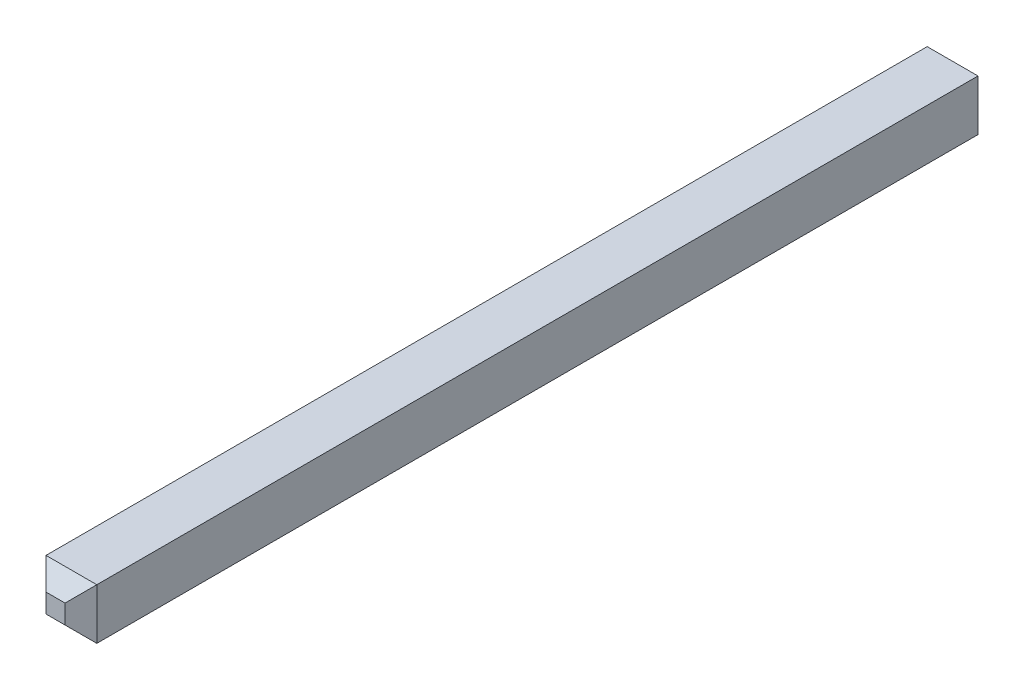
ISO-10303-21;
HEADER;
FILE_DESCRIPTION(('STEP AP214'),'2;1');
FILE_NAME('part.step','',(''),(''),'','','');
FILE_SCHEMA(('AUTOMOTIVE_DESIGN { 1 0 10303 214 1 1 1 1 }'));
ENDSEC;
DATA;
#1=APPLICATION_CONTEXT('core data for automotive mechanical design processes');
#2=APPLICATION_PROTOCOL_DEFINITION('international standard','automotive_design',2000,#1);
#3=PRODUCT_CONTEXT('',#1,'mechanical');
#4=PRODUCT('Part','Part','',(#3));
#5=PRODUCT_RELATED_PRODUCT_CATEGORY('part','',(#4));
#6=PRODUCT_DEFINITION_FORMATION('','',#4);
#7=PRODUCT_DEFINITION_CONTEXT('part definition',#1,'design');
#8=PRODUCT_DEFINITION('design','',#6,#7);
#9=PRODUCT_DEFINITION_SHAPE('','',#8);
#10=(LENGTH_UNIT() NAMED_UNIT(*) SI_UNIT(.MILLI.,.METRE.));
#11=(NAMED_UNIT(*) PLANE_ANGLE_UNIT() SI_UNIT($,.RADIAN.));
#12=(NAMED_UNIT(*) SI_UNIT($,.STERADIAN.) SOLID_ANGLE_UNIT());
#13=UNCERTAINTY_MEASURE_WITH_UNIT(LENGTH_MEASURE(1.E-05),#10,'distance_accuracy_value','');
#14=(GEOMETRIC_REPRESENTATION_CONTEXT(3) GLOBAL_UNCERTAINTY_ASSIGNED_CONTEXT((#13)) GLOBAL_UNIT_ASSIGNED_CONTEXT((#10,
#11,#12)) REPRESENTATION_CONTEXT('',''));
#15=CARTESIAN_POINT('',(0.,0.,0.));
#16=DIRECTION('',(0.,0.,1.));
#17=DIRECTION('',(1.,0.,0.));
#18=AXIS2_PLACEMENT_3D('',#15,#16,#17);
#19=CARTESIAN_POINT('',(0.32,0.32,-3.5));
#20=DIRECTION('',(1.,0.,0.));
#21=DIRECTION('',(0.,1.,0.));
#22=AXIS2_PLACEMENT_3D('',#19,#20,#21);
#23=PLANE('',#22);
#24=DIRECTION('',(0.,0.,1.));
#25=VECTOR('',#24,1.);
#26=CARTESIAN_POINT('',(0.32,0.32,-3.5));
#27=LINE('',#26,#25);
#28=CARTESIAN_POINT('',(0.32,0.32,-3.3));
#29=VERTEX_POINT('',#28);
#30=CARTESIAN_POINT('',(0.32,0.32,7.8));
#31=VERTEX_POINT('',#30);
#32=EDGE_CURVE('E121',#29,#31,#27,.T.);
#33=ORIENTED_EDGE('',*,*,#32,.T.);
#34=DIRECTION('',(0.,-1.,0.));
#35=VECTOR('',#34,1.);
#36=CARTESIAN_POINT('',(0.32,0.32,7.8));
#37=LINE('',#36,#35);
#38=CARTESIAN_POINT('',(0.32,-0.32,7.8));
#39=VERTEX_POINT('',#38);
#40=EDGE_CURVE('E140',#31,#39,#37,.T.);
#41=ORIENTED_EDGE('',*,*,#40,.T.);
#42=DIRECTION('',(0.,0.,1.));
#43=VECTOR('',#42,1.);
#44=CARTESIAN_POINT('',(0.32,-0.32,-3.5));
#45=LINE('',#44,#43);
#46=CARTESIAN_POINT('',(0.32,-0.32,-3.3));
#47=VERTEX_POINT('',#46);
#48=EDGE_CURVE('E127',#47,#39,#45,.T.);
#49=ORIENTED_EDGE('',*,*,#48,.F.);
#50=DIRECTION('',(0.,1.,0.));
#51=VECTOR('',#50,1.);
#52=CARTESIAN_POINT('',(0.32,0.32,-3.3));
#53=LINE('',#52,#51);
#54=EDGE_CURVE('E138',#47,#29,#53,.T.);
#55=ORIENTED_EDGE('',*,*,#54,.T.);
#56=EDGE_LOOP('',(#33,#41,#49,#55));
#57=FACE_BOUND('',#56,.T.);
#58=ADVANCED_FACE('F35',(#57),#23,.T.);
#59=CARTESIAN_POINT('',(-0.32,-0.32,-3.5));
#60=DIRECTION('',(0.,-1.,0.));
#61=DIRECTION('',(0.,0.,-1.));
#62=AXIS2_PLACEMENT_3D('',#59,#60,#61);
#63=PLANE('',#62);
#64=ORIENTED_EDGE('',*,*,#48,.T.);
#65=DIRECTION('',(-1.,0.,0.));
#66=VECTOR('',#65,1.);
#67=CARTESIAN_POINT('',(-0.32,-0.32,7.8));
#68=LINE('',#67,#66);
#69=CARTESIAN_POINT('',(-0.32,-0.32,7.8));
#70=VERTEX_POINT('',#69);
#71=EDGE_CURVE('E153',#39,#70,#68,.T.);
#72=ORIENTED_EDGE('',*,*,#71,.T.);
#73=DIRECTION('',(0.,0.,1.));
#74=VECTOR('',#73,1.);
#75=CARTESIAN_POINT('',(-0.32,-0.32,-3.5));
#76=LINE('',#75,#74);
#77=CARTESIAN_POINT('',(-0.32,-0.32,-3.3));
#78=VERTEX_POINT('',#77);
#79=EDGE_CURVE('E130',#78,#70,#76,.T.);
#80=ORIENTED_EDGE('',*,*,#79,.F.);
#81=DIRECTION('',(1.,0.,0.));
#82=VECTOR('',#81,1.);
#83=CARTESIAN_POINT('',(0.32,-0.32,-3.3));
#84=LINE('',#83,#82);
#85=EDGE_CURVE('E151',#78,#47,#84,.T.);
#86=ORIENTED_EDGE('',*,*,#85,.T.);
#87=EDGE_LOOP('',(#64,#72,#80,#86));
#88=FACE_BOUND('',#87,.T.);
#89=ADVANCED_FACE('F213',(#88),#63,.T.);
#90=CARTESIAN_POINT('',(-0.32,0.32,-3.5));
#91=DIRECTION('',(-1.,0.,0.));
#92=DIRECTION('',(0.,-1.,0.));
#93=AXIS2_PLACEMENT_3D('',#90,#91,#92);
#94=PLANE('',#93);
#95=ORIENTED_EDGE('',*,*,#79,.T.);
#96=DIRECTION('',(0.,1.,0.));
#97=VECTOR('',#96,1.);
#98=CARTESIAN_POINT('',(-0.32,0.32,7.8));
#99=LINE('',#98,#97);
#100=CARTESIAN_POINT('',(-0.32,0.32,7.8));
#101=VERTEX_POINT('',#100);
#102=EDGE_CURVE('E118',#70,#101,#99,.T.);
#103=ORIENTED_EDGE('',*,*,#102,.T.);
#104=DIRECTION('',(0.,0.,1.));
#105=VECTOR('',#104,1.);
#106=CARTESIAN_POINT('',(-0.32,0.32,-3.5));
#107=LINE('',#106,#105);
#108=CARTESIAN_POINT('',(-0.32,0.32,-3.3));
#109=VERTEX_POINT('',#108);
#110=EDGE_CURVE('E191',#109,#101,#107,.T.);
#111=ORIENTED_EDGE('',*,*,#110,.F.);
#112=DIRECTION('',(0.,-1.,0.));
#113=VECTOR('',#112,1.);
#114=CARTESIAN_POINT('',(-0.32,-0.32,-3.3));
#115=LINE('',#114,#113);
#116=EDGE_CURVE('E148',#109,#78,#115,.T.);
#117=ORIENTED_EDGE('',*,*,#116,.T.);
#118=EDGE_LOOP('',(#95,#103,#111,#117));
#119=FACE_BOUND('',#118,.T.);
#120=ADVANCED_FACE('F193',(#119),#94,.T.);
#121=CARTESIAN_POINT('',(-0.32,0.32,-3.5));
#122=DIRECTION('',(0.,1.,0.));
#123=DIRECTION('',(0.,0.,1.));
#124=AXIS2_PLACEMENT_3D('',#121,#122,#123);
#125=PLANE('',#124);
#126=ORIENTED_EDGE('',*,*,#110,.T.);
#127=DIRECTION('',(1.,0.,0.));
#128=VECTOR('',#127,1.);
#129=CARTESIAN_POINT('',(-0.32,0.32,7.8));
#130=LINE('',#129,#128);
#131=EDGE_CURVE('E146',#101,#31,#130,.T.);
#132=ORIENTED_EDGE('',*,*,#131,.T.);
#133=ORIENTED_EDGE('',*,*,#32,.F.);
#134=DIRECTION('',(-1.,0.,0.));
#135=VECTOR('',#134,1.);
#136=CARTESIAN_POINT('',(-0.32,0.32,-3.3));
#137=LINE('',#136,#135);
#138=EDGE_CURVE('E143',#29,#109,#137,.T.);
#139=ORIENTED_EDGE('',*,*,#138,.T.);
#140=EDGE_LOOP('',(#126,#132,#133,#139));
#141=FACE_BOUND('',#140,.T.);
#142=ADVANCED_FACE('F190',(#141),#125,.T.);
#143=CARTESIAN_POINT('',(0.,0.,-3.5));
#144=DIRECTION('',(0.,0.,1.));
#145=DIRECTION('',(1.,0.,0.));
#146=AXIS2_PLACEMENT_3D('',#143,#144,#145);
#147=PLANE('',#146);
#148=DIRECTION('',(0.,1.,0.));
#149=VECTOR('',#148,1.);
#150=CARTESIAN_POINT('',(-0.119999999999999,0.32,-3.5));
#151=LINE('',#150,#149);
#152=CARTESIAN_POINT('',(-0.119999999999999,-0.12,-3.5));
#153=VERTEX_POINT('',#152);
#154=CARTESIAN_POINT('',(-0.119999999999999,0.119999999999999,-3.5));
#155=VERTEX_POINT('',#154);
#156=EDGE_CURVE('E44',#153,#155,#151,.T.);
#157=ORIENTED_EDGE('',*,*,#156,.T.);
#158=DIRECTION('',(1.,0.,0.));
#159=VECTOR('',#158,1.);
#160=CARTESIAN_POINT('',(0.32,0.119999999999999,-3.5));
#161=LINE('',#160,#159);
#162=CARTESIAN_POINT('',(0.12,0.119999999999999,-3.5));
#163=VERTEX_POINT('',#162);
#164=EDGE_CURVE('E11',#155,#163,#161,.T.);
#165=ORIENTED_EDGE('',*,*,#164,.T.);
#166=DIRECTION('',(0.,-1.,0.));
#167=VECTOR('',#166,1.);
#168=CARTESIAN_POINT('',(0.12,-0.32,-3.5));
#169=LINE('',#168,#167);
#170=CARTESIAN_POINT('',(0.12,-0.12,-3.5));
#171=VERTEX_POINT('',#170);
#172=EDGE_CURVE('E157',#163,#171,#169,.T.);
#173=ORIENTED_EDGE('',*,*,#172,.T.);
#174=DIRECTION('',(-1.,0.,0.));
#175=VECTOR('',#174,1.);
#176=CARTESIAN_POINT('',(-0.32,-0.12,-3.5));
#177=LINE('',#176,#175);
#178=EDGE_CURVE('E155',#171,#153,#177,.T.);
#179=ORIENTED_EDGE('',*,*,#178,.T.);
#180=EDGE_LOOP('',(#157,#165,#173,#179));
#181=FACE_BOUND('',#180,.T.);
#182=ADVANCED_FACE('F179',(#181),#147,.F.);
#183=CARTESIAN_POINT('',(0.,0.,8.));
#184=DIRECTION('',(0.,0.,1.));
#185=DIRECTION('',(1.,0.,0.));
#186=AXIS2_PLACEMENT_3D('',#183,#184,#185);
#187=PLANE('',#186);
#188=DIRECTION('',(1.,0.,0.));
#189=VECTOR('',#188,1.);
#190=CARTESIAN_POINT('',(0.,-0.120000000000001,8.));
#191=LINE('',#190,#189);
#192=CARTESIAN_POINT('',(-0.120000000000001,-0.120000000000001,8.));
#193=VERTEX_POINT('',#192);
#194=CARTESIAN_POINT('',(0.120000000000001,-0.120000000000001,8.));
#195=VERTEX_POINT('',#194);
#196=EDGE_CURVE('E106',#193,#195,#191,.T.);
#197=ORIENTED_EDGE('',*,*,#196,.T.);
#198=DIRECTION('',(0.,1.,0.));
#199=VECTOR('',#198,1.);
#200=CARTESIAN_POINT('',(0.120000000000001,0.,8.));
#201=LINE('',#200,#199);
#202=CARTESIAN_POINT('',(0.120000000000001,0.120000000000001,8.));
#203=VERTEX_POINT('',#202);
#204=EDGE_CURVE('E136',#195,#203,#201,.T.);
#205=ORIENTED_EDGE('',*,*,#204,.T.);
#206=DIRECTION('',(-1.,0.,0.));
#207=VECTOR('',#206,1.);
#208=CARTESIAN_POINT('',(0.,0.120000000000001,8.));
#209=LINE('',#208,#207);
#210=CARTESIAN_POINT('',(-0.120000000000001,0.120000000000001,8.));
#211=VERTEX_POINT('',#210);
#212=EDGE_CURVE('E109',#203,#211,#209,.T.);
#213=ORIENTED_EDGE('',*,*,#212,.T.);
#214=DIRECTION('',(0.,-1.,0.));
#215=VECTOR('',#214,1.);
#216=CARTESIAN_POINT('',(-0.120000000000001,0.,8.));
#217=LINE('',#216,#215);
#218=EDGE_CURVE('E101',#211,#193,#217,.T.);
#219=ORIENTED_EDGE('',*,*,#218,.T.);
#220=EDGE_LOOP('',(#197,#205,#213,#219));
#221=FACE_BOUND('',#220,.T.);
#222=ADVANCED_FACE('F103',(#221),#187,.T.);
#223=CARTESIAN_POINT('',(-0.120000000000001,0.,8.));
#224=DIRECTION('',(0.707106781186551,0.,-0.707106781186544));
#225=DIRECTION('',(0.,-1.,0.));
#226=AXIS2_PLACEMENT_3D('',#223,#224,#225);
#227=PLANE('',#226);
#228=DIRECTION('',(-0.577350269189624,0.577350269189624,-0.577350269189629));
#229=VECTOR('',#228,1.);
#230=CARTESIAN_POINT('',(-0.080000000000001,0.0800000000000011,8.04));
#231=LINE('',#230,#229);
#232=EDGE_CURVE('E122',#101,#211,#231,.F.);
#233=ORIENTED_EDGE('',*,*,#232,.F.);
#234=ORIENTED_EDGE('',*,*,#102,.F.);
#235=DIRECTION('',(-0.577350269189624,-0.577350269189624,-0.577350269189629));
#236=VECTOR('',#235,1.);
#237=CARTESIAN_POINT('',(-0.080000000000001,-0.0800000000000012,8.04));
#238=LINE('',#237,#236);
#239=EDGE_CURVE('E116',#193,#70,#238,.T.);
#240=ORIENTED_EDGE('',*,*,#239,.F.);
#241=ORIENTED_EDGE('',*,*,#218,.F.);
#242=EDGE_LOOP('',(#233,#234,#240,#241));
#243=FACE_BOUND('',#242,.T.);
#244=ADVANCED_FACE('F117',(#243),#227,.F.);
#245=CARTESIAN_POINT('',(0.,-0.120000000000001,8.));
#246=DIRECTION('',(0.,0.707106781186551,-0.707106781186544));
#247=DIRECTION('',(1.,0.,0.));
#248=AXIS2_PLACEMENT_3D('',#245,#246,#247);
#249=PLANE('',#248);
#250=ORIENTED_EDGE('',*,*,#239,.T.);
#251=ORIENTED_EDGE('',*,*,#71,.F.);
#252=DIRECTION('',(-0.577350269189624,0.577350269189624,0.577350269189629));
#253=VECTOR('',#252,1.);
#254=CARTESIAN_POINT('',(0.0800000000000012,-0.0800000000000011,8.04));
#255=LINE('',#254,#253);
#256=EDGE_CURVE('E125',#195,#39,#255,.F.);
#257=ORIENTED_EDGE('',*,*,#256,.F.);
#258=ORIENTED_EDGE('',*,*,#196,.F.);
#259=EDGE_LOOP('',(#250,#251,#257,#258));
#260=FACE_BOUND('',#259,.T.);
#261=ADVANCED_FACE('F124',(#260),#249,.F.);
#262=CARTESIAN_POINT('',(0.,0.120000000000001,8.));
#263=DIRECTION('',(0.,-0.707106781186551,-0.707106781186544));
#264=DIRECTION('',(-1.,0.,0.));
#265=AXIS2_PLACEMENT_3D('',#262,#263,#264);
#266=PLANE('',#265);
#267=ORIENTED_EDGE('',*,*,#232,.T.);
#268=ORIENTED_EDGE('',*,*,#212,.F.);
#269=DIRECTION('',(0.577350269189624,0.577350269189624,-0.577350269189629));
#270=VECTOR('',#269,1.);
#271=CARTESIAN_POINT('',(0.0800000000000012,0.080000000000001,8.04));
#272=LINE('',#271,#270);
#273=EDGE_CURVE('E160',#31,#203,#272,.F.);
#274=ORIENTED_EDGE('',*,*,#273,.F.);
#275=ORIENTED_EDGE('',*,*,#131,.F.);
#276=EDGE_LOOP('',(#267,#268,#274,#275));
#277=FACE_BOUND('',#276,.T.);
#278=ADVANCED_FACE('F203',(#277),#266,.F.);
#279=CARTESIAN_POINT('',(0.120000000000001,0.,8.));
#280=DIRECTION('',(-0.707106781186551,0.,-0.707106781186544));
#281=DIRECTION('',(0.,1.,0.));
#282=AXIS2_PLACEMENT_3D('',#279,#280,#281);
#283=PLANE('',#282);
#284=ORIENTED_EDGE('',*,*,#256,.T.);
#285=ORIENTED_EDGE('',*,*,#40,.F.);
#286=ORIENTED_EDGE('',*,*,#273,.T.);
#287=ORIENTED_EDGE('',*,*,#204,.F.);
#288=EDGE_LOOP('',(#284,#285,#286,#287));
#289=FACE_BOUND('',#288,.T.);
#290=ADVANCED_FACE('F200',(#289),#283,.F.);
#291=CARTESIAN_POINT('',(-0.32,-0.32,-3.3));
#292=DIRECTION('',(0.,-0.707106781186545,-0.70710678118655));
#293=DIRECTION('',(-1.,0.,0.));
#294=AXIS2_PLACEMENT_3D('',#291,#292,#293);
#295=PLANE('',#294);
#296=DIRECTION('',(0.577350269189627,0.577350269189627,-0.577350269189623));
#297=VECTOR('',#296,1.);
#298=CARTESIAN_POINT('',(-0.32,-0.32,-3.3));
#299=LINE('',#298,#297);
#300=EDGE_CURVE('E166',#153,#78,#299,.F.);
#301=ORIENTED_EDGE('',*,*,#300,.F.);
#302=ORIENTED_EDGE('',*,*,#178,.F.);
#303=DIRECTION('',(0.577350269189627,-0.577350269189627,0.577350269189623));
#304=VECTOR('',#303,1.);
#305=CARTESIAN_POINT('',(0.106666666666666,-0.106666666666666,-3.51333333333333));
#306=LINE('',#305,#304);
#307=EDGE_CURVE('E39',#47,#171,#306,.F.);
#308=ORIENTED_EDGE('',*,*,#307,.F.);
#309=ORIENTED_EDGE('',*,*,#85,.F.);
#310=EDGE_LOOP('',(#301,#302,#308,#309));
#311=FACE_BOUND('',#310,.T.);
#312=ADVANCED_FACE('F37',(#311),#295,.T.);
#313=CARTESIAN_POINT('',(0.32,0.32,-3.3));
#314=DIRECTION('',(0.707106781186545,0.,-0.70710678118655));
#315=DIRECTION('',(0.,-1.,0.));
#316=AXIS2_PLACEMENT_3D('',#313,#314,#315);
#317=PLANE('',#316);
#318=ORIENTED_EDGE('',*,*,#307,.T.);
#319=ORIENTED_EDGE('',*,*,#172,.F.);
#320=DIRECTION('',(0.577350269189627,0.577350269189627,0.577350269189623));
#321=VECTOR('',#320,1.);
#322=CARTESIAN_POINT('',(0.32,0.32,-3.3));
#323=LINE('',#322,#321);
#324=EDGE_CURVE('E57',#29,#163,#323,.F.);
#325=ORIENTED_EDGE('',*,*,#324,.F.);
#326=ORIENTED_EDGE('',*,*,#54,.F.);
#327=EDGE_LOOP('',(#318,#319,#325,#326));
#328=FACE_BOUND('',#327,.T.);
#329=ADVANCED_FACE('F175',(#328),#317,.T.);
#330=CARTESIAN_POINT('',(-0.32,0.32,-3.3));
#331=DIRECTION('',(-0.707106781186545,0.,-0.70710678118655));
#332=DIRECTION('',(0.,1.,0.));
#333=AXIS2_PLACEMENT_3D('',#330,#331,#332);
#334=PLANE('',#333);
#335=ORIENTED_EDGE('',*,*,#300,.T.);
#336=ORIENTED_EDGE('',*,*,#116,.F.);
#337=DIRECTION('',(0.577350269189627,-0.577350269189627,-0.577350269189623));
#338=VECTOR('',#337,1.);
#339=CARTESIAN_POINT('',(-0.32,0.32,-3.3));
#340=LINE('',#339,#338);
#341=EDGE_CURVE('E164',#155,#109,#340,.F.);
#342=ORIENTED_EDGE('',*,*,#341,.F.);
#343=ORIENTED_EDGE('',*,*,#156,.F.);
#344=EDGE_LOOP('',(#335,#336,#342,#343));
#345=FACE_BOUND('',#344,.T.);
#346=ADVANCED_FACE('F182',(#345),#334,.T.);
#347=CARTESIAN_POINT('',(-0.32,0.32,-3.3));
#348=DIRECTION('',(0.,0.707106781186545,-0.70710678118655));
#349=DIRECTION('',(1.,0.,0.));
#350=AXIS2_PLACEMENT_3D('',#347,#348,#349);
#351=PLANE('',#350);
#352=ORIENTED_EDGE('',*,*,#324,.T.);
#353=ORIENTED_EDGE('',*,*,#164,.F.);
#354=ORIENTED_EDGE('',*,*,#341,.T.);
#355=ORIENTED_EDGE('',*,*,#138,.F.);
#356=EDGE_LOOP('',(#352,#353,#354,#355));
#357=FACE_BOUND('',#356,.T.);
#358=ADVANCED_FACE('F181',(#357),#351,.T.);
#359=CLOSED_SHELL('',(#58,#89,#120,#142,#182,#222,#244,#261,#278,#290,#312,#329,#346,#358));
#360=MANIFOLD_SOLID_BREP('B2',#359);
#361=ADVANCED_BREP_SHAPE_REPRESENTATION('',(#18,#360),#14);
#362=SHAPE_DEFINITION_REPRESENTATION(#9,#361);
ENDSEC;
END-ISO-10303-21;
